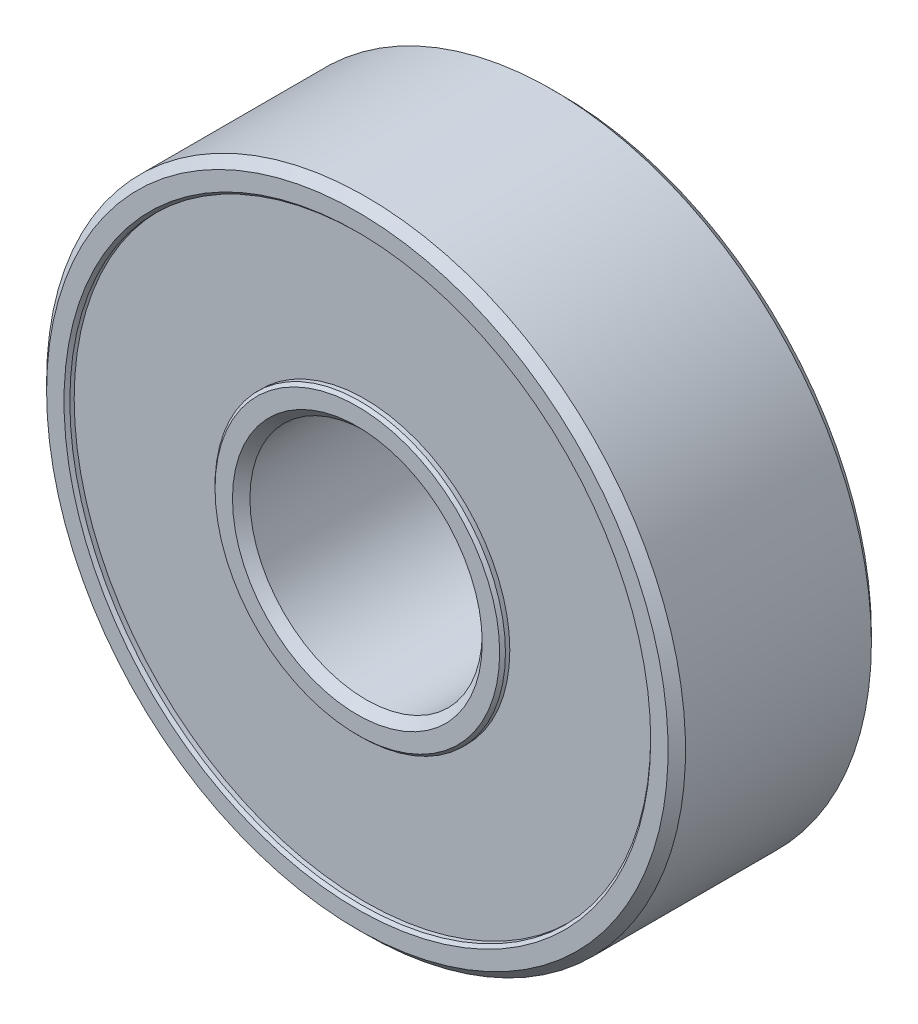
ISO-10303-21;
HEADER;
FILE_DESCRIPTION(('STEP AP214'),'2;1');
FILE_NAME('part.step','',(''),(''),'','','');
FILE_SCHEMA(('AUTOMOTIVE_DESIGN { 1 0 10303 214 1 1 1 1 }'));
ENDSEC;
DATA;
#1=APPLICATION_CONTEXT('core data for automotive mechanical design processes');
#2=APPLICATION_PROTOCOL_DEFINITION('international standard','automotive_design',2000,#1);
#3=PRODUCT_CONTEXT('',#1,'mechanical');
#4=PRODUCT('Part','Part','',(#3));
#5=PRODUCT_RELATED_PRODUCT_CATEGORY('part','',(#4));
#6=PRODUCT_DEFINITION_FORMATION('','',#4);
#7=PRODUCT_DEFINITION_CONTEXT('part definition',#1,'design');
#8=PRODUCT_DEFINITION('design','',#6,#7);
#9=PRODUCT_DEFINITION_SHAPE('','',#8);
#10=(LENGTH_UNIT() NAMED_UNIT(*) SI_UNIT(.MILLI.,.METRE.));
#11=(NAMED_UNIT(*) PLANE_ANGLE_UNIT() SI_UNIT($,.RADIAN.));
#12=(NAMED_UNIT(*) SI_UNIT($,.STERADIAN.) SOLID_ANGLE_UNIT());
#13=UNCERTAINTY_MEASURE_WITH_UNIT(LENGTH_MEASURE(1.E-05),#10,'distance_accuracy_value','');
#14=(GEOMETRIC_REPRESENTATION_CONTEXT(3) GLOBAL_UNCERTAINTY_ASSIGNED_CONTEXT((#13)) GLOBAL_UNIT_ASSIGNED_CONTEXT((#10,
#11,#12)) REPRESENTATION_CONTEXT('',''));
#15=CARTESIAN_POINT('',(0.,0.,0.));
#16=DIRECTION('',(0.,0.,1.));
#17=DIRECTION('',(1.,0.,0.));
#18=AXIS2_PLACEMENT_3D('',#15,#16,#17);
#19=CARTESIAN_POINT('',(0.,0.,3.5));
#20=DIRECTION('',(0.,0.,-1.));
#21=DIRECTION('',(-1.,0.,0.));
#22=AXIS2_PLACEMENT_3D('',#19,#20,#21);
#23=CYLINDRICAL_SURFACE('',#22,10.);
#24=CARTESIAN_POINT('',(0.,0.,-3.35));
#25=DIRECTION('',(0.,0.,1.));
#26=DIRECTION('',(1.,0.,0.));
#27=AXIS2_PLACEMENT_3D('',#24,#25,#26);
#28=CIRCLE('',#27,10.);
#29=CARTESIAN_POINT('',(10.,0.,-3.35));
#30=VERTEX_POINT('',#29);
#31=EDGE_CURVE('E61',#30,#30,#28,.T.);
#32=ORIENTED_EDGE('',*,*,#31,.T.);
#33=EDGE_LOOP('',(#32));
#34=FACE_BOUND('',#33,.T.);
#35=CARTESIAN_POINT('',(0.,0.,-3.5));
#36=DIRECTION('',(0.,0.,1.));
#37=DIRECTION('',(1.,0.,0.));
#38=AXIS2_PLACEMENT_3D('',#35,#36,#37);
#39=CIRCLE('',#38,10.);
#40=CARTESIAN_POINT('',(10.,0.,-3.5));
#41=VERTEX_POINT('',#40);
#42=EDGE_CURVE('E113',#41,#41,#39,.T.);
#43=ORIENTED_EDGE('',*,*,#42,.F.);
#44=EDGE_LOOP('',(#43));
#45=FACE_BOUND('',#44,.T.);
#46=ADVANCED_FACE('F53',(#34,#45),#23,.F.);
#47=CARTESIAN_POINT('',(0.,0.,3.40000000000001));
#48=DIRECTION('',(0.,0.,1.));
#49=DIRECTION('',(1.,0.,0.));
#50=AXIS2_PLACEMENT_3D('',#47,#48,#49);
#51=CIRCLE('',#50,10.);
#52=CARTESIAN_POINT('',(10.,0.,3.40000000000001));
#53=VERTEX_POINT('',#52);
#54=EDGE_CURVE('E83',#53,#53,#51,.T.);
#55=ORIENTED_EDGE('',*,*,#54,.T.);
#56=EDGE_LOOP('',(#55));
#57=FACE_BOUND('',#56,.T.);
#58=CARTESIAN_POINT('',(0.,0.,3.25));
#59=DIRECTION('',(0.,0.,1.));
#60=DIRECTION('',(1.,0.,0.));
#61=AXIS2_PLACEMENT_3D('',#58,#59,#60);
#62=CIRCLE('',#61,10.);
#63=CARTESIAN_POINT('',(10.,0.,3.25));
#64=VERTEX_POINT('',#63);
#65=EDGE_CURVE('E110',#64,#64,#62,.T.);
#66=ORIENTED_EDGE('',*,*,#65,.F.);
#67=EDGE_LOOP('',(#66));
#68=FACE_BOUND('',#67,.T.);
#69=ADVANCED_FACE('F143',(#57,#68),#23,.F.);
#70=CARTESIAN_POINT('',(0.,0.,3.5));
#71=DIRECTION('',(0.,0.,-1.));
#72=DIRECTION('',(-1.,0.,0.));
#73=AXIS2_PLACEMENT_3D('',#70,#71,#72);
#74=CYLINDRICAL_SURFACE('',#73,11.);
#75=CARTESIAN_POINT('',(0.,0.,3.19999999999999));
#76=DIRECTION('',(0.,0.,1.));
#77=DIRECTION('',(1.,0.,0.));
#78=AXIS2_PLACEMENT_3D('',#75,#76,#77);
#79=CIRCLE('',#78,11.);
#80=CARTESIAN_POINT('',(-11.,0.,3.19999999999999));
#81=VERTEX_POINT('',#80);
#82=EDGE_CURVE('E89',#81,#81,#79,.F.);
#83=ORIENTED_EDGE('',*,*,#82,.T.);
#84=EDGE_LOOP('',(#83));
#85=FACE_BOUND('',#84,.T.);
#86=CARTESIAN_POINT('',(0.,0.,-3.2));
#87=DIRECTION('',(0.,0.,1.));
#88=DIRECTION('',(1.,0.,0.));
#89=AXIS2_PLACEMENT_3D('',#86,#87,#88);
#90=CIRCLE('',#89,11.);
#91=CARTESIAN_POINT('',(11.,0.,-3.2));
#92=VERTEX_POINT('',#91);
#93=EDGE_CURVE('E92',#92,#92,#90,.T.);
#94=ORIENTED_EDGE('',*,*,#93,.T.);
#95=EDGE_LOOP('',(#94));
#96=FACE_BOUND('',#95,.T.);
#97=ADVANCED_FACE('F149',(#85,#96),#74,.T.);
#98=CARTESIAN_POINT('',(0.,0.,3.5));
#99=DIRECTION('',(0.,0.,1.));
#100=DIRECTION('',(1.,0.,0.));
#101=AXIS2_PLACEMENT_3D('',#98,#99,#100);
#102=PLANE('',#101);
#103=CARTESIAN_POINT('',(0.,0.,3.5));
#104=DIRECTION('',(0.,0.,1.));
#105=DIRECTION('',(1.,0.,0.));
#106=AXIS2_PLACEMENT_3D('',#103,#104,#105);
#107=CIRCLE('',#106,10.1);
#108=CARTESIAN_POINT('',(10.1,0.,3.5));
#109=VERTEX_POINT('',#108);
#110=EDGE_CURVE('E80',#109,#109,#107,.F.);
#111=ORIENTED_EDGE('',*,*,#110,.T.);
#112=EDGE_LOOP('',(#111));
#113=FACE_BOUND('',#112,.T.);
#114=CARTESIAN_POINT('',(0.,0.,3.5));
#115=DIRECTION('',(0.,0.,1.));
#116=DIRECTION('',(1.,0.,0.));
#117=AXIS2_PLACEMENT_3D('',#114,#115,#116);
#118=CIRCLE('',#117,10.7);
#119=CARTESIAN_POINT('',(-10.7,0.,3.5));
#120=VERTEX_POINT('',#119);
#121=EDGE_CURVE('E95',#120,#120,#118,.T.);
#122=ORIENTED_EDGE('',*,*,#121,.T.);
#123=EDGE_LOOP('',(#122));
#124=FACE_BOUND('',#123,.T.);
#125=ADVANCED_FACE('F298',(#113,#124),#102,.T.);
#126=CARTESIAN_POINT('',(0.,0.,-3.5));
#127=DIRECTION('',(0.,0.,1.));
#128=DIRECTION('',(1.,0.,0.));
#129=AXIS2_PLACEMENT_3D('',#126,#127,#128);
#130=PLANE('',#129);
#131=CARTESIAN_POINT('',(0.,0.,-3.5));
#132=DIRECTION('',(0.,0.,1.));
#133=DIRECTION('',(1.,0.,0.));
#134=AXIS2_PLACEMENT_3D('',#131,#132,#133);
#135=CIRCLE('',#134,10.7);
#136=CARTESIAN_POINT('',(10.7,0.,-3.5));
#137=VERTEX_POINT('',#136);
#138=EDGE_CURVE('E86',#137,#137,#135,.F.);
#139=ORIENTED_EDGE('',*,*,#138,.T.);
#140=EDGE_LOOP('',(#139));
#141=FACE_BOUND('',#140,.T.);
#142=ORIENTED_EDGE('',*,*,#42,.T.);
#143=EDGE_LOOP('',(#142));
#144=FACE_BOUND('',#143,.T.);
#145=ADVANCED_FACE('F138',(#141,#144),#130,.F.);
#146=CARTESIAN_POINT('',(0.,0.,3.25));
#147=DIRECTION('',(0.,0.,1.));
#148=DIRECTION('',(1.,0.,0.));
#149=AXIS2_PLACEMENT_3D('',#146,#147,#148);
#150=PLANE('',#149);
#151=CARTESIAN_POINT('',(0.,0.,3.25));
#152=DIRECTION('',(0.,0.,1.));
#153=DIRECTION('',(1.,0.,0.));
#154=AXIS2_PLACEMENT_3D('',#151,#152,#153);
#155=CIRCLE('',#154,5.);
#156=CARTESIAN_POINT('',(5.,0.,3.25));
#157=VERTEX_POINT('',#156);
#158=EDGE_CURVE('E116',#157,#157,#155,.T.);
#159=ORIENTED_EDGE('',*,*,#158,.F.);
#160=EDGE_LOOP('',(#159));
#161=FACE_BOUND('',#160,.T.);
#162=ORIENTED_EDGE('',*,*,#65,.T.);
#163=EDGE_LOOP('',(#162));
#164=FACE_BOUND('',#163,.T.);
#165=ADVANCED_FACE('F127',(#161,#164),#150,.T.);
#166=CARTESIAN_POINT('',(0.,0.,-3.25));
#167=DIRECTION('',(0.,0.,1.));
#168=DIRECTION('',(1.,0.,0.));
#169=AXIS2_PLACEMENT_3D('',#166,#167,#168);
#170=PLANE('',#169);
#171=CARTESIAN_POINT('',(0.,0.,-3.25));
#172=DIRECTION('',(0.,0.,1.));
#173=DIRECTION('',(1.,0.,0.));
#174=AXIS2_PLACEMENT_3D('',#171,#172,#173);
#175=CIRCLE('',#174,9.9);
#176=CARTESIAN_POINT('',(9.9,0.,-3.25));
#177=VERTEX_POINT('',#176);
#178=EDGE_CURVE('E11',#177,#177,#175,.F.);
#179=ORIENTED_EDGE('',*,*,#178,.T.);
#180=EDGE_LOOP('',(#179));
#181=FACE_BOUND('',#180,.T.);
#182=CARTESIAN_POINT('',(0.,0.,-3.25));
#183=DIRECTION('',(0.,0.,1.));
#184=DIRECTION('',(1.,0.,0.));
#185=AXIS2_PLACEMENT_3D('',#182,#183,#184);
#186=CIRCLE('',#185,5.);
#187=CARTESIAN_POINT('',(5.,0.,-3.25));
#188=VERTEX_POINT('',#187);
#189=EDGE_CURVE('E119',#188,#188,#186,.F.);
#190=ORIENTED_EDGE('',*,*,#189,.F.);
#191=EDGE_LOOP('',(#190));
#192=FACE_BOUND('',#191,.T.);
#193=ADVANCED_FACE('F125',(#181,#192),#170,.F.);
#194=CARTESIAN_POINT('',(0.,0.,3.5));
#195=DIRECTION('',(0.,0.,-1.));
#196=DIRECTION('',(-1.,0.,0.));
#197=AXIS2_PLACEMENT_3D('',#194,#195,#196);
#198=CYLINDRICAL_SURFACE('',#197,5.);
#199=CARTESIAN_POINT('',(0.,0.,-3.4));
#200=DIRECTION('',(0.,0.,1.));
#201=DIRECTION('',(1.,0.,0.));
#202=AXIS2_PLACEMENT_3D('',#199,#200,#201);
#203=CIRCLE('',#202,5.);
#204=CARTESIAN_POINT('',(5.,0.,-3.4));
#205=VERTEX_POINT('',#204);
#206=EDGE_CURVE('E69',#205,#205,#203,.T.);
#207=ORIENTED_EDGE('',*,*,#206,.T.);
#208=EDGE_LOOP('',(#207));
#209=FACE_BOUND('',#208,.T.);
#210=ORIENTED_EDGE('',*,*,#189,.T.);
#211=EDGE_LOOP('',(#210));
#212=FACE_BOUND('',#211,.T.);
#213=ADVANCED_FACE('F123',(#209,#212),#198,.T.);
#214=CARTESIAN_POINT('',(0.,0.,3.5));
#215=DIRECTION('',(0.,0.,-1.));
#216=DIRECTION('',(-1.,0.,0.));
#217=AXIS2_PLACEMENT_3D('',#214,#215,#216);
#218=CYLINDRICAL_SURFACE('',#217,4.);
#219=CARTESIAN_POINT('',(0.,0.,-3.2));
#220=DIRECTION('',(0.,0.,1.));
#221=DIRECTION('',(1.,0.,0.));
#222=AXIS2_PLACEMENT_3D('',#219,#220,#221);
#223=CIRCLE('',#222,4.);
#224=CARTESIAN_POINT('',(4.,0.,-3.2));
#225=VERTEX_POINT('',#224);
#226=EDGE_CURVE('E101',#225,#225,#223,.F.);
#227=ORIENTED_EDGE('',*,*,#226,.T.);
#228=EDGE_LOOP('',(#227));
#229=FACE_BOUND('',#228,.T.);
#230=CARTESIAN_POINT('',(0.,0.,3.2));
#231=DIRECTION('',(0.,0.,1.));
#232=DIRECTION('',(1.,0.,0.));
#233=AXIS2_PLACEMENT_3D('',#230,#231,#232);
#234=CIRCLE('',#233,4.);
#235=CARTESIAN_POINT('',(4.,0.,3.2));
#236=VERTEX_POINT('',#235);
#237=EDGE_CURVE('E104',#236,#236,#234,.T.);
#238=ORIENTED_EDGE('',*,*,#237,.T.);
#239=EDGE_LOOP('',(#238));
#240=FACE_BOUND('',#239,.T.);
#241=ADVANCED_FACE('F133',(#229,#240),#218,.F.);
#242=CARTESIAN_POINT('',(0.,0.,3.4));
#243=DIRECTION('',(0.,0.,1.));
#244=DIRECTION('',(1.,0.,0.));
#245=AXIS2_PLACEMENT_3D('',#242,#243,#244);
#246=CIRCLE('',#245,5.);
#247=CARTESIAN_POINT('',(5.,0.,3.4));
#248=VERTEX_POINT('',#247);
#249=EDGE_CURVE('E74',#248,#248,#246,.F.);
#250=ORIENTED_EDGE('',*,*,#249,.T.);
#251=EDGE_LOOP('',(#250));
#252=FACE_BOUND('',#251,.T.);
#253=ORIENTED_EDGE('',*,*,#158,.T.);
#254=EDGE_LOOP('',(#253));
#255=FACE_BOUND('',#254,.T.);
#256=ADVANCED_FACE('F136',(#252,#255),#198,.T.);
#257=CARTESIAN_POINT('',(0.,0.,3.5));
#258=DIRECTION('',(0.,0.,1.));
#259=DIRECTION('',(1.,0.,0.));
#260=AXIS2_PLACEMENT_3D('',#257,#258,#259);
#261=PLANE('',#260);
#262=CARTESIAN_POINT('',(0.,0.,3.5));
#263=DIRECTION('',(0.,0.,1.));
#264=DIRECTION('',(1.,0.,0.));
#265=AXIS2_PLACEMENT_3D('',#262,#263,#264);
#266=CIRCLE('',#265,4.9);
#267=CARTESIAN_POINT('',(4.9,0.,3.5));
#268=VERTEX_POINT('',#267);
#269=EDGE_CURVE('E77',#268,#268,#266,.T.);
#270=ORIENTED_EDGE('',*,*,#269,.T.);
#271=EDGE_LOOP('',(#270));
#272=FACE_BOUND('',#271,.T.);
#273=CARTESIAN_POINT('',(0.,0.,3.5));
#274=DIRECTION('',(0.,0.,1.));
#275=DIRECTION('',(1.,0.,0.));
#276=AXIS2_PLACEMENT_3D('',#273,#274,#275);
#277=CIRCLE('',#276,4.3);
#278=CARTESIAN_POINT('',(4.3,0.,3.5));
#279=VERTEX_POINT('',#278);
#280=EDGE_CURVE('E98',#279,#279,#277,.F.);
#281=ORIENTED_EDGE('',*,*,#280,.T.);
#282=EDGE_LOOP('',(#281));
#283=FACE_BOUND('',#282,.T.);
#284=ADVANCED_FACE('F212',(#272,#283),#261,.T.);
#285=CARTESIAN_POINT('',(0.,0.,-3.5));
#286=DIRECTION('',(0.,0.,1.));
#287=DIRECTION('',(1.,0.,0.));
#288=AXIS2_PLACEMENT_3D('',#285,#286,#287);
#289=PLANE('',#288);
#290=CARTESIAN_POINT('',(0.,0.,-3.5));
#291=DIRECTION('',(0.,0.,1.));
#292=DIRECTION('',(1.,0.,0.));
#293=AXIS2_PLACEMENT_3D('',#290,#291,#292);
#294=CIRCLE('',#293,4.9);
#295=CARTESIAN_POINT('',(4.9,0.,-3.5));
#296=VERTEX_POINT('',#295);
#297=EDGE_CURVE('E65',#296,#296,#294,.F.);
#298=ORIENTED_EDGE('',*,*,#297,.T.);
#299=EDGE_LOOP('',(#298));
#300=FACE_BOUND('',#299,.T.);
#301=CARTESIAN_POINT('',(0.,0.,-3.5));
#302=DIRECTION('',(0.,0.,1.));
#303=DIRECTION('',(1.,0.,0.));
#304=AXIS2_PLACEMENT_3D('',#301,#302,#303);
#305=CIRCLE('',#304,4.3);
#306=CARTESIAN_POINT('',(4.3,0.,-3.5));
#307=VERTEX_POINT('',#306);
#308=EDGE_CURVE('E107',#307,#307,#305,.T.);
#309=ORIENTED_EDGE('',*,*,#308,.T.);
#310=EDGE_LOOP('',(#309));
#311=FACE_BOUND('',#310,.T.);
#312=ADVANCED_FACE('F163',(#300,#311),#289,.F.);
#313=CARTESIAN_POINT('',(0.,0.,-3.5));
#314=DIRECTION('',(0.,0.,-1.));
#315=DIRECTION('',(-1.,0.,0.));
#316=AXIS2_PLACEMENT_3D('',#313,#314,#315);
#317=CONICAL_SURFACE('',#316,4.3,0.785398163397451);
#318=ORIENTED_EDGE('',*,*,#226,.F.);
#319=EDGE_LOOP('',(#318));
#320=FACE_BOUND('',#319,.T.);
#321=ORIENTED_EDGE('',*,*,#308,.F.);
#322=EDGE_LOOP('',(#321));
#323=FACE_BOUND('',#322,.T.);
#324=ADVANCED_FACE('F156',(#320,#323),#317,.F.);
#325=CARTESIAN_POINT('',(0.,0.,3.2));
#326=DIRECTION('',(0.,0.,1.));
#327=DIRECTION('',(1.,0.,0.));
#328=AXIS2_PLACEMENT_3D('',#325,#326,#327);
#329=CONICAL_SURFACE('',#328,4.,0.785398163397451);
#330=ORIENTED_EDGE('',*,*,#280,.F.);
#331=EDGE_LOOP('',(#330));
#332=FACE_BOUND('',#331,.T.);
#333=ORIENTED_EDGE('',*,*,#237,.F.);
#334=EDGE_LOOP('',(#333));
#335=FACE_BOUND('',#334,.T.);
#336=ADVANCED_FACE('F162',(#332,#335),#329,.F.);
#337=CARTESIAN_POINT('',(0.,0.,3.5));
#338=DIRECTION('',(0.,0.,-1.));
#339=DIRECTION('',(-1.,0.,0.));
#340=AXIS2_PLACEMENT_3D('',#337,#338,#339);
#341=CONICAL_SURFACE('',#340,10.7,0.785398163397437);
#342=CARTESIAN_POINT('',(-11.,0.,3.19999999999999));
#343=CARTESIAN_POINT('',(-10.996875,0.,3.203125));
#344=CARTESIAN_POINT('',(-10.99375,0.,3.20624999999999));
#345=CARTESIAN_POINT('',(-10.9875,0.,3.2125));
#346=CARTESIAN_POINT('',(-10.984375,0.,3.21562499999999));
#347=CARTESIAN_POINT('',(-10.978125,0.,3.22187499999999));
#348=CARTESIAN_POINT('',(-10.975,0.,3.225));
#349=CARTESIAN_POINT('',(-10.96875,0.,3.23125));
#350=CARTESIAN_POINT('',(-10.965625,0.,3.234375));
#351=CARTESIAN_POINT('',(-10.959375,0.,3.240625));
#352=CARTESIAN_POINT('',(-10.95625,0.,3.24375));
#353=CARTESIAN_POINT('',(-10.95,0.,3.25));
#354=CARTESIAN_POINT('',(-10.946875,0.,3.253125));
#355=CARTESIAN_POINT('',(-10.940625,0.,3.259375));
#356=CARTESIAN_POINT('',(-10.9375,0.,3.2625));
#357=CARTESIAN_POINT('',(-10.93125,0.,3.26875));
#358=CARTESIAN_POINT('',(-10.928125,0.,3.271875));
#359=CARTESIAN_POINT('',(-10.921875,0.,3.278125));
#360=CARTESIAN_POINT('',(-10.91875,0.,3.28125));
#361=CARTESIAN_POINT('',(-10.9125,0.,3.2875));
#362=CARTESIAN_POINT('',(-10.909375,0.,3.290625));
#363=CARTESIAN_POINT('',(-10.903125,0.,3.296875));
#364=CARTESIAN_POINT('',(-10.9,0.,3.3));
#365=CARTESIAN_POINT('',(-10.89375,0.,3.30625));
#366=CARTESIAN_POINT('',(-10.890625,0.,3.309375));
#367=CARTESIAN_POINT('',(-10.884375,0.,3.315625));
#368=CARTESIAN_POINT('',(-10.88125,0.,3.31875));
#369=CARTESIAN_POINT('',(-10.875,0.,3.325));
#370=CARTESIAN_POINT('',(-10.871875,0.,3.328125));
#371=CARTESIAN_POINT('',(-10.865625,0.,3.334375));
#372=CARTESIAN_POINT('',(-10.8625,0.,3.3375));
#373=CARTESIAN_POINT('',(-10.85625,0.,3.34375));
#374=CARTESIAN_POINT('',(-10.853125,0.,3.346875));
#375=CARTESIAN_POINT('',(-10.846875,0.,3.353125));
#376=CARTESIAN_POINT('',(-10.84375,0.,3.35625));
#377=CARTESIAN_POINT('',(-10.8375,0.,3.3625));
#378=CARTESIAN_POINT('',(-10.834375,0.,3.365625));
#379=CARTESIAN_POINT('',(-10.828125,0.,3.371875));
#380=CARTESIAN_POINT('',(-10.825,0.,3.375));
#381=CARTESIAN_POINT('',(-10.81875,0.,3.38125));
#382=CARTESIAN_POINT('',(-10.815625,0.,3.384375));
#383=CARTESIAN_POINT('',(-10.809375,0.,3.390625));
#384=CARTESIAN_POINT('',(-10.80625,0.,3.39375));
#385=CARTESIAN_POINT('',(-10.8,0.,3.4));
#386=CARTESIAN_POINT('',(-10.796875,0.,3.403125));
#387=CARTESIAN_POINT('',(-10.790625,0.,3.409375));
#388=CARTESIAN_POINT('',(-10.7875,0.,3.4125));
#389=CARTESIAN_POINT('',(-10.78125,0.,3.41875));
#390=CARTESIAN_POINT('',(-10.778125,0.,3.421875));
#391=CARTESIAN_POINT('',(-10.771875,0.,3.428125));
#392=CARTESIAN_POINT('',(-10.76875,0.,3.43125));
#393=CARTESIAN_POINT('',(-10.7625,0.,3.4375));
#394=CARTESIAN_POINT('',(-10.759375,0.,3.440625));
#395=CARTESIAN_POINT('',(-10.753125,0.,3.446875));
#396=CARTESIAN_POINT('',(-10.75,0.,3.45));
#397=CARTESIAN_POINT('',(-10.74375,0.,3.45625));
#398=CARTESIAN_POINT('',(-10.740625,0.,3.459375));
#399=CARTESIAN_POINT('',(-10.734375,0.,3.465625));
#400=CARTESIAN_POINT('',(-10.73125,0.,3.46875));
#401=CARTESIAN_POINT('',(-10.725,0.,3.475));
#402=CARTESIAN_POINT('',(-10.721875,0.,3.478125));
#403=CARTESIAN_POINT('',(-10.715625,0.,3.484375));
#404=CARTESIAN_POINT('',(-10.7125,0.,3.4875));
#405=CARTESIAN_POINT('',(-10.70625,0.,3.49375));
#406=CARTESIAN_POINT('',(-10.703125,0.,3.496875));
#407=CARTESIAN_POINT('',(-10.7,0.,3.5));
#408=B_SPLINE_CURVE_WITH_KNOTS('',3,(#342,#343,#344,#345,#346,#347,#348,#349,#350,#351,#352,
#353,#354,#355,#356,#357,#358,#359,#360,#361,#362,#363,#364,#365,#366,#367,#368,#369,#370,#371,
#372,#373,#374,#375,#376,#377,#378,#379,#380,#381,#382,#383,#384,#385,#386,#387,#388,#389,#390,
#391,#392,#393,#394,#395,#396,#397,#398,#399,#400,#401,#402,#403,#404,#405,#406,#407),
.UNSPECIFIED.,.F.,.F.,(4,2,2,2,2,2,2,2,2,2,2,2,2,2,2,2,2,2,2,2,2,2,2,2,2,2,2,2,2,2,2,2,4),(0.,
0.0132582521472469,0.0265165042944954,0.0397747564417438,0.0530330085889911,0.0662912607362392,
0.0795495128834864,0.0928077650307349,0.106066017177982,0.11932426932523,0.132582521472479,
0.145840773619726,0.159099025766974,0.172357277914221,0.18561553006147,0.198873782208717,
0.212132034355965,0.225390286503212,0.238648538650461,0.251906790797709,0.265165042944957,
0.278423295092205,0.291681547239452,0.3049397993867,0.318198051533948,0.331456303681196,
0.344714555828444,0.357972807975691,0.37123106012294,0.384489312270187,0.397747564417435,
0.411005816564682,0.424264068711931),.UNSPECIFIED.);
#409=EDGE_CURVE('BSEAM170',#81,#120,#408,.T.);
#410=ORIENTED_EDGE('',*,*,#82,.F.);
#411=ORIENTED_EDGE('',*,*,#121,.F.);
#412=ORIENTED_EDGE('',*,*,#409,.T.);
#413=ORIENTED_EDGE('',*,*,#409,.F.);
#414=EDGE_LOOP('',(#410,#412,#411,#413));
#415=FACE_BOUND('',#414,.T.);
#416=ADVANCED_FACE('F170',(#415),#341,.T.);
#417=CARTESIAN_POINT('',(0.,0.,-3.2));
#418=DIRECTION('',(0.,0.,1.));
#419=DIRECTION('',(1.,0.,0.));
#420=AXIS2_PLACEMENT_3D('',#417,#418,#419);
#421=CONICAL_SURFACE('',#420,11.,0.785398163397451);
#422=ORIENTED_EDGE('',*,*,#138,.F.);
#423=EDGE_LOOP('',(#422));
#424=FACE_BOUND('',#423,.T.);
#425=ORIENTED_EDGE('',*,*,#93,.F.);
#426=EDGE_LOOP('',(#425));
#427=FACE_BOUND('',#426,.T.);
#428=ADVANCED_FACE('F177',(#424,#427),#421,.T.);
#429=CARTESIAN_POINT('',(0.,0.,3.40000000000001));
#430=DIRECTION('',(0.,0.,1.));
#431=DIRECTION('',(1.,0.,0.));
#432=AXIS2_PLACEMENT_3D('',#429,#430,#431);
#433=CONICAL_SURFACE('',#432,10.,0.78539816339744);
#434=ORIENTED_EDGE('',*,*,#110,.F.);
#435=EDGE_LOOP('',(#434));
#436=FACE_BOUND('',#435,.T.);
#437=ORIENTED_EDGE('',*,*,#54,.F.);
#438=EDGE_LOOP('',(#437));
#439=FACE_BOUND('',#438,.T.);
#440=ADVANCED_FACE('F183',(#436,#439),#433,.F.);
#441=CARTESIAN_POINT('',(0.,0.,3.5));
#442=DIRECTION('',(0.,0.,-1.));
#443=DIRECTION('',(-1.,0.,0.));
#444=AXIS2_PLACEMENT_3D('',#441,#442,#443);
#445=CONICAL_SURFACE('',#444,4.9,0.785398163397448);
#446=ORIENTED_EDGE('',*,*,#249,.F.);
#447=EDGE_LOOP('',(#446));
#448=FACE_BOUND('',#447,.T.);
#449=ORIENTED_EDGE('',*,*,#269,.F.);
#450=EDGE_LOOP('',(#449));
#451=FACE_BOUND('',#450,.T.);
#452=ADVANCED_FACE('F190',(#448,#451),#445,.T.);
#453=CARTESIAN_POINT('',(0.,0.,-3.4));
#454=DIRECTION('',(0.,0.,1.));
#455=DIRECTION('',(1.,0.,0.));
#456=AXIS2_PLACEMENT_3D('',#453,#454,#455);
#457=CONICAL_SURFACE('',#456,5.,0.785398163397444);
#458=ORIENTED_EDGE('',*,*,#297,.F.);
#459=EDGE_LOOP('',(#458));
#460=FACE_BOUND('',#459,.T.);
#461=ORIENTED_EDGE('',*,*,#206,.F.);
#462=EDGE_LOOP('',(#461));
#463=FACE_BOUND('',#462,.T.);
#464=ADVANCED_FACE('F196',(#460,#463),#457,.T.);
#465=CARTESIAN_POINT('',(0.,0.,-3.35));
#466=DIRECTION('',(0.,0.,-1.));
#467=DIRECTION('',(-1.,0.,0.));
#468=AXIS2_PLACEMENT_3D('',#465,#466,#467);
#469=CONICAL_SURFACE('',#468,10.,0.78539816339744);
#470=ORIENTED_EDGE('',*,*,#178,.F.);
#471=EDGE_LOOP('',(#470));
#472=FACE_BOUND('',#471,.T.);
#473=ORIENTED_EDGE('',*,*,#31,.F.);
#474=EDGE_LOOP('',(#473));
#475=FACE_BOUND('',#474,.T.);
#476=ADVANCED_FACE('F56',(#472,#475),#469,.F.);
#477=CLOSED_SHELL('',(#46,#69,#97,#125,#145,#165,#193,#213,#241,#256,#284,#312,#324,#336,#416,
#428,#440,#452,#464,#476));
#478=MANIFOLD_SOLID_BREP('B2',#477);
#479=ADVANCED_BREP_SHAPE_REPRESENTATION('',(#18,#478),#14);
#480=SHAPE_DEFINITION_REPRESENTATION(#9,#479);
ENDSEC;
END-ISO-10303-21;
